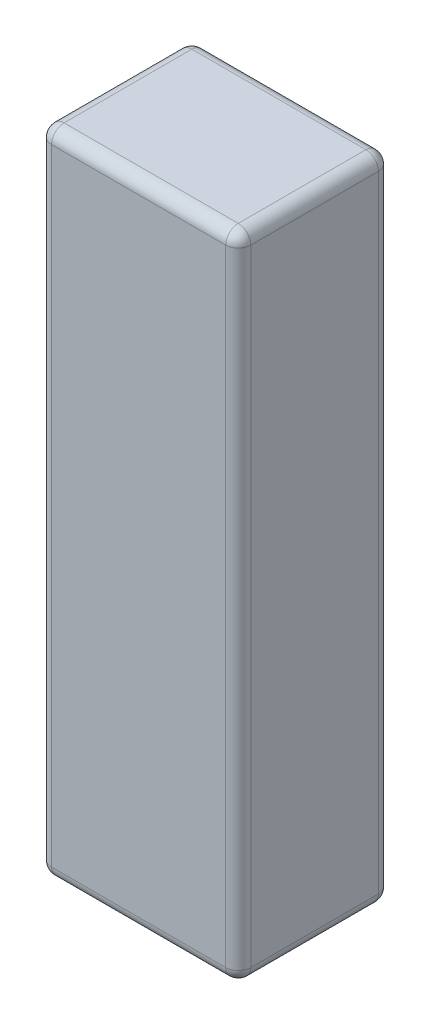
ISO-10303-21;
HEADER;
FILE_DESCRIPTION(('STEP AP214'),'2;1');
FILE_NAME('part.step','',(''),(''),'','','');
FILE_SCHEMA(('AUTOMOTIVE_DESIGN { 1 0 10303 214 1 1 1 1 }'));
ENDSEC;
DATA;
#1=APPLICATION_CONTEXT('core data for automotive mechanical design processes');
#2=APPLICATION_PROTOCOL_DEFINITION('international standard','automotive_design',2000,#1);
#3=PRODUCT_CONTEXT('',#1,'mechanical');
#4=PRODUCT('Part','Part','',(#3));
#5=PRODUCT_RELATED_PRODUCT_CATEGORY('part','',(#4));
#6=PRODUCT_DEFINITION_FORMATION('','',#4);
#7=PRODUCT_DEFINITION_CONTEXT('part definition',#1,'design');
#8=PRODUCT_DEFINITION('design','',#6,#7);
#9=PRODUCT_DEFINITION_SHAPE('','',#8);
#10=(LENGTH_UNIT() NAMED_UNIT(*) SI_UNIT(.MILLI.,.METRE.));
#11=(NAMED_UNIT(*) PLANE_ANGLE_UNIT() SI_UNIT($,.RADIAN.));
#12=(NAMED_UNIT(*) SI_UNIT($,.STERADIAN.) SOLID_ANGLE_UNIT());
#13=UNCERTAINTY_MEASURE_WITH_UNIT(LENGTH_MEASURE(1.E-05),#10,'distance_accuracy_value','');
#14=(GEOMETRIC_REPRESENTATION_CONTEXT(3) GLOBAL_UNCERTAINTY_ASSIGNED_CONTEXT((#13)) GLOBAL_UNIT_ASSIGNED_CONTEXT((#10,
#11,#12)) REPRESENTATION_CONTEXT('',''));
#15=CARTESIAN_POINT('',(0.,0.,0.));
#16=DIRECTION('',(0.,0.,1.));
#17=DIRECTION('',(1.,0.,0.));
#18=AXIS2_PLACEMENT_3D('',#15,#16,#17);
#19=CARTESIAN_POINT('',(9.525,-31.115,14.605));
#20=DIRECTION('',(-1.,0.,0.));
#21=DIRECTION('',(0.,0.,1.));
#22=AXIS2_PLACEMENT_3D('',#19,#20,#21);
#23=PLANE('',#22);
#24=DIRECTION('',(0.,0.,-1.));
#25=VECTOR('',#24,1.);
#26=CARTESIAN_POINT('',(9.525,-29.915,14.605));
#27=LINE('',#26,#25);
#28=CARTESIAN_POINT('',(9.525,-29.915,13.405));
#29=VERTEX_POINT('',#28);
#30=CARTESIAN_POINT('',(9.525,-29.915,1.2));
#31=VERTEX_POINT('',#30);
#32=EDGE_CURVE('E194',#29,#31,#27,.T.);
#33=ORIENTED_EDGE('',*,*,#32,.T.);
#34=DIRECTION('',(0.,1.,0.));
#35=VECTOR('',#34,1.);
#36=CARTESIAN_POINT('',(9.525,31.115,1.2));
#37=LINE('',#36,#35);
#38=CARTESIAN_POINT('',(9.525,29.915,1.2));
#39=VERTEX_POINT('',#38);
#40=EDGE_CURVE('E197',#31,#39,#37,.T.);
#41=ORIENTED_EDGE('',*,*,#40,.T.);
#42=DIRECTION('',(0.,0.,-1.));
#43=VECTOR('',#42,1.);
#44=CARTESIAN_POINT('',(9.525,29.915,14.605));
#45=LINE('',#44,#43);
#46=CARTESIAN_POINT('',(9.525,29.915,13.405));
#47=VERTEX_POINT('',#46);
#48=EDGE_CURVE('E192',#39,#47,#45,.F.);
#49=ORIENTED_EDGE('',*,*,#48,.T.);
#50=DIRECTION('',(0.,1.,0.));
#51=VECTOR('',#50,1.);
#52=CARTESIAN_POINT('',(9.525,-31.115,13.405));
#53=LINE('',#52,#51);
#54=EDGE_CURVE('E190',#47,#29,#53,.F.);
#55=ORIENTED_EDGE('',*,*,#54,.T.);
#56=EDGE_LOOP('',(#33,#41,#49,#55));
#57=FACE_BOUND('',#56,.T.);
#58=ADVANCED_FACE('F43',(#57),#23,.F.);
#59=CARTESIAN_POINT('',(-9.525,31.115,14.605));
#60=DIRECTION('',(0.,-1.,0.));
#61=DIRECTION('',(0.,0.,-1.));
#62=AXIS2_PLACEMENT_3D('',#59,#60,#61);
#63=PLANE('',#62);
#64=DIRECTION('',(0.,0.,-1.));
#65=VECTOR('',#64,1.);
#66=CARTESIAN_POINT('',(8.325,31.115,14.605));
#67=LINE('',#66,#65);
#68=CARTESIAN_POINT('',(8.325,31.115,13.405));
#69=VERTEX_POINT('',#68);
#70=CARTESIAN_POINT('',(8.325,31.115,1.2));
#71=VERTEX_POINT('',#70);
#72=EDGE_CURVE('E176',#69,#71,#67,.T.);
#73=ORIENTED_EDGE('',*,*,#72,.T.);
#74=DIRECTION('',(-1.,0.,0.));
#75=VECTOR('',#74,1.);
#76=CARTESIAN_POINT('',(-9.525,31.115,1.2));
#77=LINE('',#76,#75);
#78=CARTESIAN_POINT('',(-8.325,31.115,1.2));
#79=VERTEX_POINT('',#78);
#80=EDGE_CURVE('E181',#71,#79,#77,.T.);
#81=ORIENTED_EDGE('',*,*,#80,.T.);
#82=DIRECTION('',(0.,0.,-1.));
#83=VECTOR('',#82,1.);
#84=CARTESIAN_POINT('',(-8.325,31.115,14.605));
#85=LINE('',#84,#83);
#86=CARTESIAN_POINT('',(-8.325,31.115,13.405));
#87=VERTEX_POINT('',#86);
#88=EDGE_CURVE('E178',#79,#87,#85,.F.);
#89=ORIENTED_EDGE('',*,*,#88,.T.);
#90=DIRECTION('',(-1.,0.,0.));
#91=VECTOR('',#90,1.);
#92=CARTESIAN_POINT('',(-9.525,31.115,13.405));
#93=LINE('',#92,#91);
#94=EDGE_CURVE('E174',#87,#69,#93,.F.);
#95=ORIENTED_EDGE('',*,*,#94,.T.);
#96=EDGE_LOOP('',(#73,#81,#89,#95));
#97=FACE_BOUND('',#96,.T.);
#98=ADVANCED_FACE('F315',(#97),#63,.F.);
#99=CARTESIAN_POINT('',(-9.525,-31.115,14.605));
#100=DIRECTION('',(1.,0.,0.));
#101=DIRECTION('',(0.,0.,-1.));
#102=AXIS2_PLACEMENT_3D('',#99,#100,#101);
#103=PLANE('',#102);
#104=DIRECTION('',(0.,0.,-1.));
#105=VECTOR('',#104,1.);
#106=CARTESIAN_POINT('',(-9.525,29.915,14.605));
#107=LINE('',#106,#105);
#108=CARTESIAN_POINT('',(-9.525,29.915,13.405));
#109=VERTEX_POINT('',#108);
#110=CARTESIAN_POINT('',(-9.525,29.915,1.2));
#111=VERTEX_POINT('',#110);
#112=EDGE_CURVE('E142',#109,#111,#107,.T.);
#113=ORIENTED_EDGE('',*,*,#112,.T.);
#114=DIRECTION('',(0.,-1.,0.));
#115=VECTOR('',#114,1.);
#116=CARTESIAN_POINT('',(-9.525,-31.115,1.2));
#117=LINE('',#116,#115);
#118=CARTESIAN_POINT('',(-9.525,-29.915,1.2));
#119=VERTEX_POINT('',#118);
#120=EDGE_CURVE('E138',#111,#119,#117,.T.);
#121=ORIENTED_EDGE('',*,*,#120,.T.);
#122=DIRECTION('',(0.,0.,-1.));
#123=VECTOR('',#122,1.);
#124=CARTESIAN_POINT('',(-9.525,-29.915,14.605));
#125=LINE('',#124,#123);
#126=CARTESIAN_POINT('',(-9.525,-29.915,13.405));
#127=VERTEX_POINT('',#126);
#128=EDGE_CURVE('E130',#119,#127,#125,.F.);
#129=ORIENTED_EDGE('',*,*,#128,.T.);
#130=DIRECTION('',(0.,-1.,0.));
#131=VECTOR('',#130,1.);
#132=CARTESIAN_POINT('',(-9.525,-31.115,13.405));
#133=LINE('',#132,#131);
#134=EDGE_CURVE('E135',#127,#109,#133,.F.);
#135=ORIENTED_EDGE('',*,*,#134,.T.);
#136=EDGE_LOOP('',(#113,#121,#129,#135));
#137=FACE_BOUND('',#136,.T.);
#138=ADVANCED_FACE('F133',(#137),#103,.F.);
#139=CARTESIAN_POINT('',(-9.525,-31.115,14.605));
#140=DIRECTION('',(0.,1.,0.));
#141=DIRECTION('',(0.,0.,1.));
#142=AXIS2_PLACEMENT_3D('',#139,#140,#141);
#143=PLANE('',#142);
#144=DIRECTION('',(0.,0.,-1.));
#145=VECTOR('',#144,1.);
#146=CARTESIAN_POINT('',(-8.325,-31.115,14.605));
#147=LINE('',#146,#145);
#148=CARTESIAN_POINT('',(-8.325,-31.115,13.405));
#149=VERTEX_POINT('',#148);
#150=CARTESIAN_POINT('',(-8.325,-31.115,1.2));
#151=VERTEX_POINT('',#150);
#152=EDGE_CURVE('E150',#149,#151,#147,.T.);
#153=ORIENTED_EDGE('',*,*,#152,.T.);
#154=DIRECTION('',(1.,0.,0.));
#155=VECTOR('',#154,1.);
#156=CARTESIAN_POINT('',(9.525,-31.115,1.2));
#157=LINE('',#156,#155);
#158=CARTESIAN_POINT('',(8.325,-31.115,1.2));
#159=VERTEX_POINT('',#158);
#160=EDGE_CURVE('E188',#151,#159,#157,.T.);
#161=ORIENTED_EDGE('',*,*,#160,.T.);
#162=DIRECTION('',(0.,0.,-1.));
#163=VECTOR('',#162,1.);
#164=CARTESIAN_POINT('',(8.325,-31.115,14.605));
#165=LINE('',#164,#163);
#166=CARTESIAN_POINT('',(8.325,-31.115,13.405));
#167=VERTEX_POINT('',#166);
#168=EDGE_CURVE('E185',#159,#167,#165,.F.);
#169=ORIENTED_EDGE('',*,*,#168,.T.);
#170=DIRECTION('',(1.,0.,0.));
#171=VECTOR('',#170,1.);
#172=CARTESIAN_POINT('',(-9.525,-31.115,13.405));
#173=LINE('',#172,#171);
#174=EDGE_CURVE('E183',#167,#149,#173,.F.);
#175=ORIENTED_EDGE('',*,*,#174,.T.);
#176=EDGE_LOOP('',(#153,#161,#169,#175));
#177=FACE_BOUND('',#176,.T.);
#178=ADVANCED_FACE('F306',(#177),#143,.F.);
#179=CARTESIAN_POINT('',(0.,0.,14.605));
#180=DIRECTION('',(0.,0.,-1.));
#181=DIRECTION('',(-1.,0.,0.));
#182=AXIS2_PLACEMENT_3D('',#179,#180,#181);
#183=PLANE('',#182);
#184=DIRECTION('',(0.,-1.,0.));
#185=VECTOR('',#184,1.);
#186=CARTESIAN_POINT('',(-8.325,0.,14.605));
#187=LINE('',#186,#185);
#188=CARTESIAN_POINT('',(-8.325,29.915,14.605));
#189=VERTEX_POINT('',#188);
#190=CARTESIAN_POINT('',(-8.325,-29.915,14.605));
#191=VERTEX_POINT('',#190);
#192=EDGE_CURVE('E52',#189,#191,#187,.T.);
#193=ORIENTED_EDGE('',*,*,#192,.T.);
#194=DIRECTION('',(1.,0.,0.));
#195=VECTOR('',#194,1.);
#196=CARTESIAN_POINT('',(0.,-29.915,14.605));
#197=LINE('',#196,#195);
#198=CARTESIAN_POINT('',(8.325,-29.915,14.605));
#199=VERTEX_POINT('',#198);
#200=EDGE_CURVE('E11',#191,#199,#197,.T.);
#201=ORIENTED_EDGE('',*,*,#200,.T.);
#202=DIRECTION('',(0.,1.,0.));
#203=VECTOR('',#202,1.);
#204=CARTESIAN_POINT('',(8.325,0.,14.605));
#205=LINE('',#204,#203);
#206=CARTESIAN_POINT('',(8.325,29.915,14.605));
#207=VERTEX_POINT('',#206);
#208=EDGE_CURVE('E208',#199,#207,#205,.T.);
#209=ORIENTED_EDGE('',*,*,#208,.T.);
#210=DIRECTION('',(-1.,0.,0.));
#211=VECTOR('',#210,1.);
#212=CARTESIAN_POINT('',(0.,29.915,14.605));
#213=LINE('',#212,#211);
#214=EDGE_CURVE('E63',#207,#189,#213,.T.);
#215=ORIENTED_EDGE('',*,*,#214,.T.);
#216=EDGE_LOOP('',(#193,#201,#209,#215));
#217=FACE_BOUND('',#216,.T.);
#218=ADVANCED_FACE('F308',(#217),#183,.F.);
#219=CARTESIAN_POINT('',(0.,0.,0.));
#220=DIRECTION('',(0.,0.,-1.));
#221=DIRECTION('',(-1.,0.,0.));
#222=AXIS2_PLACEMENT_3D('',#219,#220,#221);
#223=PLANE('',#222);
#224=DIRECTION('',(0.,-1.,0.));
#225=VECTOR('',#224,1.);
#226=CARTESIAN_POINT('',(-8.325,31.115,0.));
#227=LINE('',#226,#225);
#228=CARTESIAN_POINT('',(-8.325,-29.915,0.));
#229=VERTEX_POINT('',#228);
#230=CARTESIAN_POINT('',(-8.325,29.915,0.));
#231=VERTEX_POINT('',#230);
#232=EDGE_CURVE('E203',#229,#231,#227,.F.);
#233=ORIENTED_EDGE('',*,*,#232,.T.);
#234=DIRECTION('',(-1.,0.,0.));
#235=VECTOR('',#234,1.);
#236=CARTESIAN_POINT('',(9.525,29.915,0.));
#237=LINE('',#236,#235);
#238=CARTESIAN_POINT('',(8.325,29.915,0.));
#239=VERTEX_POINT('',#238);
#240=EDGE_CURVE('E205',#231,#239,#237,.F.);
#241=ORIENTED_EDGE('',*,*,#240,.T.);
#242=DIRECTION('',(0.,1.,0.));
#243=VECTOR('',#242,1.);
#244=CARTESIAN_POINT('',(8.325,-31.115,0.));
#245=LINE('',#244,#243);
#246=CARTESIAN_POINT('',(8.325,-29.915,0.));
#247=VERTEX_POINT('',#246);
#248=EDGE_CURVE('E199',#239,#247,#245,.F.);
#249=ORIENTED_EDGE('',*,*,#248,.T.);
#250=DIRECTION('',(1.,0.,0.));
#251=VECTOR('',#250,1.);
#252=CARTESIAN_POINT('',(-9.525,-29.915,0.));
#253=LINE('',#252,#251);
#254=EDGE_CURVE('E201',#247,#229,#253,.F.);
#255=ORIENTED_EDGE('',*,*,#254,.T.);
#256=EDGE_LOOP('',(#233,#241,#249,#255));
#257=FACE_BOUND('',#256,.T.);
#258=ADVANCED_FACE('F275',(#257),#223,.T.);
#259=CARTESIAN_POINT('',(8.325,-29.915,14.605));
#260=DIRECTION('',(0.,0.,-1.));
#261=DIRECTION('',(-1.,0.,0.));
#262=AXIS2_PLACEMENT_3D('',#259,#260,#261);
#263=CYLINDRICAL_SURFACE('',#262,1.2);
#264=CARTESIAN_POINT('',(8.325,-29.915,13.405));
#265=DIRECTION('',(0.,0.,1.));
#266=DIRECTION('',(1.,0.,0.));
#267=AXIS2_PLACEMENT_3D('',#264,#265,#266);
#268=CIRCLE('',#267,1.2);
#269=EDGE_CURVE('E47',#167,#29,#268,.T.);
#270=ORIENTED_EDGE('',*,*,#269,.F.);
#271=ORIENTED_EDGE('',*,*,#168,.F.);
#272=CARTESIAN_POINT('',(8.325,-29.915,1.2));
#273=DIRECTION('',(0.,0.,-1.));
#274=DIRECTION('',(-1.,0.,0.));
#275=AXIS2_PLACEMENT_3D('',#272,#273,#274);
#276=CIRCLE('',#275,1.2);
#277=EDGE_CURVE('E170',#31,#159,#276,.T.);
#278=ORIENTED_EDGE('',*,*,#277,.F.);
#279=ORIENTED_EDGE('',*,*,#32,.F.);
#280=EDGE_LOOP('',(#270,#271,#278,#279));
#281=FACE_BOUND('',#280,.T.);
#282=ADVANCED_FACE('F45',(#281),#263,.T.);
#283=CARTESIAN_POINT('',(8.325,-29.915,13.405));
#284=DIRECTION('',(1.,0.,0.));
#285=DIRECTION('',(0.,0.,-1.));
#286=AXIS2_PLACEMENT_3D('',#283,#284,#285);
#287=SPHERICAL_SURFACE('',#286,1.2);
#288=CARTESIAN_POINT('',(8.325,-29.915,13.405));
#289=DIRECTION('',(1.,0.,0.));
#290=DIRECTION('',(0.,0.,-1.));
#291=AXIS2_PLACEMENT_3D('',#288,#289,#290);
#292=CIRCLE('',#291,1.2);
#293=EDGE_CURVE('E254',#167,#199,#292,.F.);
#294=ORIENTED_EDGE('',*,*,#293,.F.);
#295=ORIENTED_EDGE('',*,*,#269,.T.);
#296=CARTESIAN_POINT('',(8.325,-29.915,13.405));
#297=DIRECTION('',(0.,-1.,0.));
#298=DIRECTION('',(0.,0.,-1.));
#299=AXIS2_PLACEMENT_3D('',#296,#297,#298);
#300=CIRCLE('',#299,1.2);
#301=EDGE_CURVE('E257',#199,#29,#300,.F.);
#302=ORIENTED_EDGE('',*,*,#301,.F.);
#303=EDGE_LOOP('',(#294,#295,#302));
#304=FACE_BOUND('',#303,.T.);
#305=ADVANCED_FACE('F301',(#304),#287,.T.);
#306=CARTESIAN_POINT('',(8.325,-29.915,1.2));
#307=DIRECTION('',(0.,-1.,0.));
#308=DIRECTION('',(0.,0.,-1.));
#309=AXIS2_PLACEMENT_3D('',#306,#307,#308);
#310=SPHERICAL_SURFACE('',#309,1.2);
#311=CARTESIAN_POINT('',(8.325,-29.915,1.2));
#312=DIRECTION('',(0.,-1.,0.));
#313=DIRECTION('',(0.,0.,-1.));
#314=AXIS2_PLACEMENT_3D('',#311,#312,#313);
#315=CIRCLE('',#314,1.2);
#316=EDGE_CURVE('E248',#31,#247,#315,.F.);
#317=ORIENTED_EDGE('',*,*,#316,.F.);
#318=ORIENTED_EDGE('',*,*,#277,.T.);
#319=CARTESIAN_POINT('',(8.325,-29.915,1.2));
#320=DIRECTION('',(1.,0.,0.));
#321=DIRECTION('',(0.,0.,-1.));
#322=AXIS2_PLACEMENT_3D('',#319,#320,#321);
#323=CIRCLE('',#322,1.2);
#324=EDGE_CURVE('E251',#247,#159,#323,.F.);
#325=ORIENTED_EDGE('',*,*,#324,.F.);
#326=EDGE_LOOP('',(#317,#318,#325));
#327=FACE_BOUND('',#326,.T.);
#328=ADVANCED_FACE('F264',(#327),#310,.T.);
#329=CARTESIAN_POINT('',(8.325,0.,13.405));
#330=DIRECTION('',(0.,1.,0.));
#331=DIRECTION('',(0.,0.,1.));
#332=AXIS2_PLACEMENT_3D('',#329,#330,#331);
#333=CYLINDRICAL_SURFACE('',#332,1.2);
#334=ORIENTED_EDGE('',*,*,#301,.T.);
#335=ORIENTED_EDGE('',*,*,#54,.F.);
#336=CARTESIAN_POINT('',(8.325,29.915,13.405));
#337=DIRECTION('',(0.,1.,0.));
#338=DIRECTION('',(0.,0.,1.));
#339=AXIS2_PLACEMENT_3D('',#336,#337,#338);
#340=CIRCLE('',#339,1.2);
#341=EDGE_CURVE('E242',#207,#47,#340,.T.);
#342=ORIENTED_EDGE('',*,*,#341,.F.);
#343=ORIENTED_EDGE('',*,*,#208,.F.);
#344=EDGE_LOOP('',(#334,#335,#342,#343));
#345=FACE_BOUND('',#344,.T.);
#346=ADVANCED_FACE('F296',(#345),#333,.T.);
#347=CARTESIAN_POINT('',(0.,-29.915,13.405));
#348=DIRECTION('',(1.,0.,0.));
#349=DIRECTION('',(0.,0.,-1.));
#350=AXIS2_PLACEMENT_3D('',#347,#348,#349);
#351=CYLINDRICAL_SURFACE('',#350,1.2);
#352=ORIENTED_EDGE('',*,*,#293,.T.);
#353=ORIENTED_EDGE('',*,*,#200,.F.);
#354=CARTESIAN_POINT('',(-8.325,-29.915,13.405));
#355=DIRECTION('',(-1.,0.,0.));
#356=DIRECTION('',(0.,0.,1.));
#357=AXIS2_PLACEMENT_3D('',#354,#355,#356);
#358=CIRCLE('',#357,1.2);
#359=EDGE_CURVE('E154',#149,#191,#358,.T.);
#360=ORIENTED_EDGE('',*,*,#359,.F.);
#361=ORIENTED_EDGE('',*,*,#174,.F.);
#362=EDGE_LOOP('',(#352,#353,#360,#361));
#363=FACE_BOUND('',#362,.T.);
#364=ADVANCED_FACE('F304',(#363),#351,.T.);
#365=CARTESIAN_POINT('',(-8.325,-29.915,14.605));
#366=DIRECTION('',(0.,0.,-1.));
#367=DIRECTION('',(-1.,0.,0.));
#368=AXIS2_PLACEMENT_3D('',#365,#366,#367);
#369=CYLINDRICAL_SURFACE('',#368,1.2);
#370=CARTESIAN_POINT('',(-8.325,-29.915,1.2));
#371=DIRECTION('',(0.,0.,-1.));
#372=DIRECTION('',(-1.,0.,0.));
#373=AXIS2_PLACEMENT_3D('',#370,#371,#372);
#374=CIRCLE('',#373,1.2);
#375=EDGE_CURVE('E155',#151,#119,#374,.T.);
#376=ORIENTED_EDGE('',*,*,#375,.F.);
#377=ORIENTED_EDGE('',*,*,#152,.F.);
#378=CARTESIAN_POINT('',(-8.325,-29.915,13.405));
#379=DIRECTION('',(0.,0.,1.));
#380=DIRECTION('',(1.,0.,0.));
#381=AXIS2_PLACEMENT_3D('',#378,#379,#380);
#382=CIRCLE('',#381,1.2);
#383=EDGE_CURVE('E146',#127,#149,#382,.T.);
#384=ORIENTED_EDGE('',*,*,#383,.F.);
#385=ORIENTED_EDGE('',*,*,#128,.F.);
#386=EDGE_LOOP('',(#376,#377,#384,#385));
#387=FACE_BOUND('',#386,.T.);
#388=ADVANCED_FACE('F148',(#387),#369,.T.);
#389=CARTESIAN_POINT('',(-9.525,-29.915,1.2));
#390=DIRECTION('',(-1.,0.,0.));
#391=DIRECTION('',(0.,0.,1.));
#392=AXIS2_PLACEMENT_3D('',#389,#390,#391);
#393=CYLINDRICAL_SURFACE('',#392,1.2);
#394=ORIENTED_EDGE('',*,*,#324,.T.);
#395=ORIENTED_EDGE('',*,*,#160,.F.);
#396=CARTESIAN_POINT('',(-8.325,-29.915,1.2));
#397=DIRECTION('',(-1.,0.,0.));
#398=DIRECTION('',(0.,0.,1.));
#399=AXIS2_PLACEMENT_3D('',#396,#397,#398);
#400=CIRCLE('',#399,1.2);
#401=EDGE_CURVE('E238',#229,#151,#400,.T.);
#402=ORIENTED_EDGE('',*,*,#401,.F.);
#403=ORIENTED_EDGE('',*,*,#254,.F.);
#404=EDGE_LOOP('',(#394,#395,#402,#403));
#405=FACE_BOUND('',#404,.T.);
#406=ADVANCED_FACE('F271',(#405),#393,.T.);
#407=CARTESIAN_POINT('',(8.325,-31.115,1.2));
#408=DIRECTION('',(0.,-1.,0.));
#409=DIRECTION('',(0.,0.,-1.));
#410=AXIS2_PLACEMENT_3D('',#407,#408,#409);
#411=CYLINDRICAL_SURFACE('',#410,1.2);
#412=ORIENTED_EDGE('',*,*,#316,.T.);
#413=ORIENTED_EDGE('',*,*,#248,.F.);
#414=CARTESIAN_POINT('',(8.325,29.915,1.2));
#415=DIRECTION('',(0.,1.,0.));
#416=DIRECTION('',(0.,0.,1.));
#417=AXIS2_PLACEMENT_3D('',#414,#415,#416);
#418=CIRCLE('',#417,1.2);
#419=EDGE_CURVE('E235',#39,#239,#418,.T.);
#420=ORIENTED_EDGE('',*,*,#419,.F.);
#421=ORIENTED_EDGE('',*,*,#40,.F.);
#422=EDGE_LOOP('',(#412,#413,#420,#421));
#423=FACE_BOUND('',#422,.T.);
#424=ADVANCED_FACE('F281',(#423),#411,.T.);
#425=CARTESIAN_POINT('',(8.325,29.915,14.605));
#426=DIRECTION('',(0.,0.,-1.));
#427=DIRECTION('',(-1.,0.,0.));
#428=AXIS2_PLACEMENT_3D('',#425,#426,#427);
#429=CYLINDRICAL_SURFACE('',#428,1.2);
#430=CARTESIAN_POINT('',(8.325,29.915,13.405));
#431=DIRECTION('',(0.,0.,1.));
#432=DIRECTION('',(1.,0.,0.));
#433=AXIS2_PLACEMENT_3D('',#430,#431,#432);
#434=CIRCLE('',#433,1.2);
#435=EDGE_CURVE('E245',#47,#69,#434,.T.);
#436=ORIENTED_EDGE('',*,*,#435,.F.);
#437=ORIENTED_EDGE('',*,*,#48,.F.);
#438=CARTESIAN_POINT('',(8.325,29.915,1.2));
#439=DIRECTION('',(0.,0.,-1.));
#440=DIRECTION('',(-1.,0.,0.));
#441=AXIS2_PLACEMENT_3D('',#438,#439,#440);
#442=CIRCLE('',#441,1.2);
#443=EDGE_CURVE('E232',#71,#39,#442,.T.);
#444=ORIENTED_EDGE('',*,*,#443,.F.);
#445=ORIENTED_EDGE('',*,*,#72,.F.);
#446=EDGE_LOOP('',(#436,#437,#444,#445));
#447=FACE_BOUND('',#446,.T.);
#448=ADVANCED_FACE('F288',(#447),#429,.T.);
#449=CARTESIAN_POINT('',(8.325,29.915,13.405));
#450=DIRECTION('',(1.,0.,0.));
#451=DIRECTION('',(0.,0.,-1.));
#452=AXIS2_PLACEMENT_3D('',#449,#450,#451);
#453=SPHERICAL_SURFACE('',#452,1.2);
#454=ORIENTED_EDGE('',*,*,#341,.T.);
#455=ORIENTED_EDGE('',*,*,#435,.T.);
#456=CARTESIAN_POINT('',(8.325,29.915,13.405));
#457=DIRECTION('',(1.,0.,0.));
#458=DIRECTION('',(0.,0.,-1.));
#459=AXIS2_PLACEMENT_3D('',#456,#457,#458);
#460=CIRCLE('',#459,1.2);
#461=EDGE_CURVE('E161',#207,#69,#460,.F.);
#462=ORIENTED_EDGE('',*,*,#461,.F.);
#463=EDGE_LOOP('',(#454,#455,#462));
#464=FACE_BOUND('',#463,.T.);
#465=ADVANCED_FACE('F294',(#464),#453,.T.);
#466=CARTESIAN_POINT('',(-8.325,-29.915,13.405));
#467=DIRECTION('',(0.,-1.,0.));
#468=DIRECTION('',(0.,0.,-1.));
#469=AXIS2_PLACEMENT_3D('',#466,#467,#468);
#470=SPHERICAL_SURFACE('',#469,1.2);
#471=ORIENTED_EDGE('',*,*,#383,.T.);
#472=ORIENTED_EDGE('',*,*,#359,.T.);
#473=CARTESIAN_POINT('',(-8.325,-29.915,13.405));
#474=DIRECTION('',(0.,-1.,0.));
#475=DIRECTION('',(0.,0.,-1.));
#476=AXIS2_PLACEMENT_3D('',#473,#474,#475);
#477=CIRCLE('',#476,1.2);
#478=EDGE_CURVE('E158',#127,#191,#477,.F.);
#479=ORIENTED_EDGE('',*,*,#478,.F.);
#480=EDGE_LOOP('',(#471,#472,#479));
#481=FACE_BOUND('',#480,.T.);
#482=ADVANCED_FACE('F159',(#481),#470,.T.);
#483=CARTESIAN_POINT('',(-8.325,-29.915,1.2));
#484=DIRECTION('',(0.,-1.,0.));
#485=DIRECTION('',(0.,0.,-1.));
#486=AXIS2_PLACEMENT_3D('',#483,#484,#485);
#487=SPHERICAL_SURFACE('',#486,1.2);
#488=ORIENTED_EDGE('',*,*,#401,.T.);
#489=ORIENTED_EDGE('',*,*,#375,.T.);
#490=CARTESIAN_POINT('',(-8.325,-29.915,1.2));
#491=DIRECTION('',(0.,-1.,0.));
#492=DIRECTION('',(0.,0.,-1.));
#493=AXIS2_PLACEMENT_3D('',#490,#491,#492);
#494=CIRCLE('',#493,1.2);
#495=EDGE_CURVE('E162',#229,#119,#494,.F.);
#496=ORIENTED_EDGE('',*,*,#495,.F.);
#497=EDGE_LOOP('',(#488,#489,#496));
#498=FACE_BOUND('',#497,.T.);
#499=ADVANCED_FACE('F355',(#498),#487,.T.);
#500=CARTESIAN_POINT('',(8.325,29.915,1.2));
#501=DIRECTION('',(1.,0.,0.));
#502=DIRECTION('',(0.,0.,-1.));
#503=AXIS2_PLACEMENT_3D('',#500,#501,#502);
#504=SPHERICAL_SURFACE('',#503,1.2);
#505=ORIENTED_EDGE('',*,*,#443,.T.);
#506=ORIENTED_EDGE('',*,*,#419,.T.);
#507=CARTESIAN_POINT('',(8.325,29.915,1.2));
#508=DIRECTION('',(1.,0.,0.));
#509=DIRECTION('',(0.,0.,-1.));
#510=AXIS2_PLACEMENT_3D('',#507,#508,#509);
#511=CIRCLE('',#510,1.2);
#512=EDGE_CURVE('E226',#71,#239,#511,.F.);
#513=ORIENTED_EDGE('',*,*,#512,.F.);
#514=EDGE_LOOP('',(#505,#506,#513));
#515=FACE_BOUND('',#514,.T.);
#516=ADVANCED_FACE('F351',(#515),#504,.T.);
#517=CARTESIAN_POINT('',(0.,29.915,13.405));
#518=DIRECTION('',(-1.,0.,0.));
#519=DIRECTION('',(0.,0.,1.));
#520=AXIS2_PLACEMENT_3D('',#517,#518,#519);
#521=CYLINDRICAL_SURFACE('',#520,1.2);
#522=ORIENTED_EDGE('',*,*,#461,.T.);
#523=ORIENTED_EDGE('',*,*,#94,.F.);
#524=CARTESIAN_POINT('',(-8.325,29.915,13.405));
#525=DIRECTION('',(-1.,0.,0.));
#526=DIRECTION('',(0.,0.,1.));
#527=AXIS2_PLACEMENT_3D('',#524,#525,#526);
#528=CIRCLE('',#527,1.2);
#529=EDGE_CURVE('E223',#189,#87,#528,.T.);
#530=ORIENTED_EDGE('',*,*,#529,.F.);
#531=ORIENTED_EDGE('',*,*,#214,.F.);
#532=EDGE_LOOP('',(#522,#523,#530,#531));
#533=FACE_BOUND('',#532,.T.);
#534=ADVANCED_FACE('F348',(#533),#521,.T.);
#535=CARTESIAN_POINT('',(-8.325,0.,13.405));
#536=DIRECTION('',(0.,-1.,0.));
#537=DIRECTION('',(0.,0.,-1.));
#538=AXIS2_PLACEMENT_3D('',#535,#536,#537);
#539=CYLINDRICAL_SURFACE('',#538,1.2);
#540=ORIENTED_EDGE('',*,*,#478,.T.);
#541=ORIENTED_EDGE('',*,*,#192,.F.);
#542=CARTESIAN_POINT('',(-8.325,29.915,13.405));
#543=DIRECTION('',(0.,1.,0.));
#544=DIRECTION('',(0.,0.,1.));
#545=AXIS2_PLACEMENT_3D('',#542,#543,#544);
#546=CIRCLE('',#545,1.2);
#547=EDGE_CURVE('E166',#109,#189,#546,.T.);
#548=ORIENTED_EDGE('',*,*,#547,.F.);
#549=ORIENTED_EDGE('',*,*,#134,.F.);
#550=EDGE_LOOP('',(#540,#541,#548,#549));
#551=FACE_BOUND('',#550,.T.);
#552=ADVANCED_FACE('F164',(#551),#539,.T.);
#553=CARTESIAN_POINT('',(-8.325,-31.115,1.2));
#554=DIRECTION('',(0.,1.,0.));
#555=DIRECTION('',(0.,0.,1.));
#556=AXIS2_PLACEMENT_3D('',#553,#554,#555);
#557=CYLINDRICAL_SURFACE('',#556,1.2);
#558=ORIENTED_EDGE('',*,*,#495,.T.);
#559=ORIENTED_EDGE('',*,*,#120,.F.);
#560=CARTESIAN_POINT('',(-8.325,29.915,1.2));
#561=DIRECTION('',(0.,1.,0.));
#562=DIRECTION('',(0.,0.,1.));
#563=AXIS2_PLACEMENT_3D('',#560,#561,#562);
#564=CIRCLE('',#563,1.2);
#565=EDGE_CURVE('E219',#231,#111,#564,.T.);
#566=ORIENTED_EDGE('',*,*,#565,.F.);
#567=ORIENTED_EDGE('',*,*,#232,.F.);
#568=EDGE_LOOP('',(#558,#559,#566,#567));
#569=FACE_BOUND('',#568,.T.);
#570=ADVANCED_FACE('F341',(#569),#557,.T.);
#571=CARTESIAN_POINT('',(-9.525,29.915,1.2));
#572=DIRECTION('',(1.,0.,0.));
#573=DIRECTION('',(0.,0.,-1.));
#574=AXIS2_PLACEMENT_3D('',#571,#572,#573);
#575=CYLINDRICAL_SURFACE('',#574,1.2);
#576=ORIENTED_EDGE('',*,*,#512,.T.);
#577=ORIENTED_EDGE('',*,*,#240,.F.);
#578=CARTESIAN_POINT('',(-8.325,29.915,1.2));
#579=DIRECTION('',(-1.,0.,0.));
#580=DIRECTION('',(0.,0.,1.));
#581=AXIS2_PLACEMENT_3D('',#578,#579,#580);
#582=CIRCLE('',#581,1.2);
#583=EDGE_CURVE('E216',#79,#231,#582,.T.);
#584=ORIENTED_EDGE('',*,*,#583,.F.);
#585=ORIENTED_EDGE('',*,*,#80,.F.);
#586=EDGE_LOOP('',(#576,#577,#584,#585));
#587=FACE_BOUND('',#586,.T.);
#588=ADVANCED_FACE('F337',(#587),#575,.T.);
#589=CARTESIAN_POINT('',(-8.325,29.915,13.405));
#590=DIRECTION('',(0.,0.,1.));
#591=DIRECTION('',(1.,0.,0.));
#592=AXIS2_PLACEMENT_3D('',#589,#590,#591);
#593=SPHERICAL_SURFACE('',#592,1.2);
#594=ORIENTED_EDGE('',*,*,#547,.T.);
#595=ORIENTED_EDGE('',*,*,#529,.T.);
#596=CARTESIAN_POINT('',(-8.325,29.915,13.405));
#597=DIRECTION('',(0.,0.,1.));
#598=DIRECTION('',(1.,0.,0.));
#599=AXIS2_PLACEMENT_3D('',#596,#597,#598);
#600=CIRCLE('',#599,1.2);
#601=EDGE_CURVE('E214',#109,#87,#600,.F.);
#602=ORIENTED_EDGE('',*,*,#601,.F.);
#603=EDGE_LOOP('',(#594,#595,#602));
#604=FACE_BOUND('',#603,.T.);
#605=ADVANCED_FACE('F333',(#604),#593,.T.);
#606=CARTESIAN_POINT('',(-8.325,29.915,1.2));
#607=DIRECTION('',(0.,0.,-1.));
#608=DIRECTION('',(-1.,0.,0.));
#609=AXIS2_PLACEMENT_3D('',#606,#607,#608);
#610=SPHERICAL_SURFACE('',#609,1.2);
#611=ORIENTED_EDGE('',*,*,#583,.T.);
#612=ORIENTED_EDGE('',*,*,#565,.T.);
#613=CARTESIAN_POINT('',(-8.325,29.915,1.2));
#614=DIRECTION('',(0.,0.,-1.));
#615=DIRECTION('',(-1.,0.,0.));
#616=AXIS2_PLACEMENT_3D('',#613,#614,#615);
#617=CIRCLE('',#616,1.2);
#618=EDGE_CURVE('E212',#79,#111,#617,.F.);
#619=ORIENTED_EDGE('',*,*,#618,.F.);
#620=EDGE_LOOP('',(#611,#612,#619));
#621=FACE_BOUND('',#620,.T.);
#622=ADVANCED_FACE('F329',(#621),#610,.T.);
#623=CARTESIAN_POINT('',(-8.325,29.915,14.605));
#624=DIRECTION('',(0.,0.,-1.));
#625=DIRECTION('',(-1.,0.,0.));
#626=AXIS2_PLACEMENT_3D('',#623,#624,#625);
#627=CYLINDRICAL_SURFACE('',#626,1.2);
#628=ORIENTED_EDGE('',*,*,#601,.T.);
#629=ORIENTED_EDGE('',*,*,#88,.F.);
#630=ORIENTED_EDGE('',*,*,#618,.T.);
#631=ORIENTED_EDGE('',*,*,#112,.F.);
#632=EDGE_LOOP('',(#628,#629,#630,#631));
#633=FACE_BOUND('',#632,.T.);
#634=ADVANCED_FACE('F326',(#633),#627,.T.);
#635=CLOSED_SHELL('',(#58,#98,#138,#178,#218,#258,#282,#305,#328,#346,#364,#388,#406,#424,#448,
#465,#482,#499,#516,#534,#552,#570,#588,#605,#622,#634));
#636=MANIFOLD_SOLID_BREP('B2',#635);
#637=ADVANCED_BREP_SHAPE_REPRESENTATION('',(#18,#636),#14);
#638=SHAPE_DEFINITION_REPRESENTATION(#9,#637);
ENDSEC;
END-ISO-10303-21;
